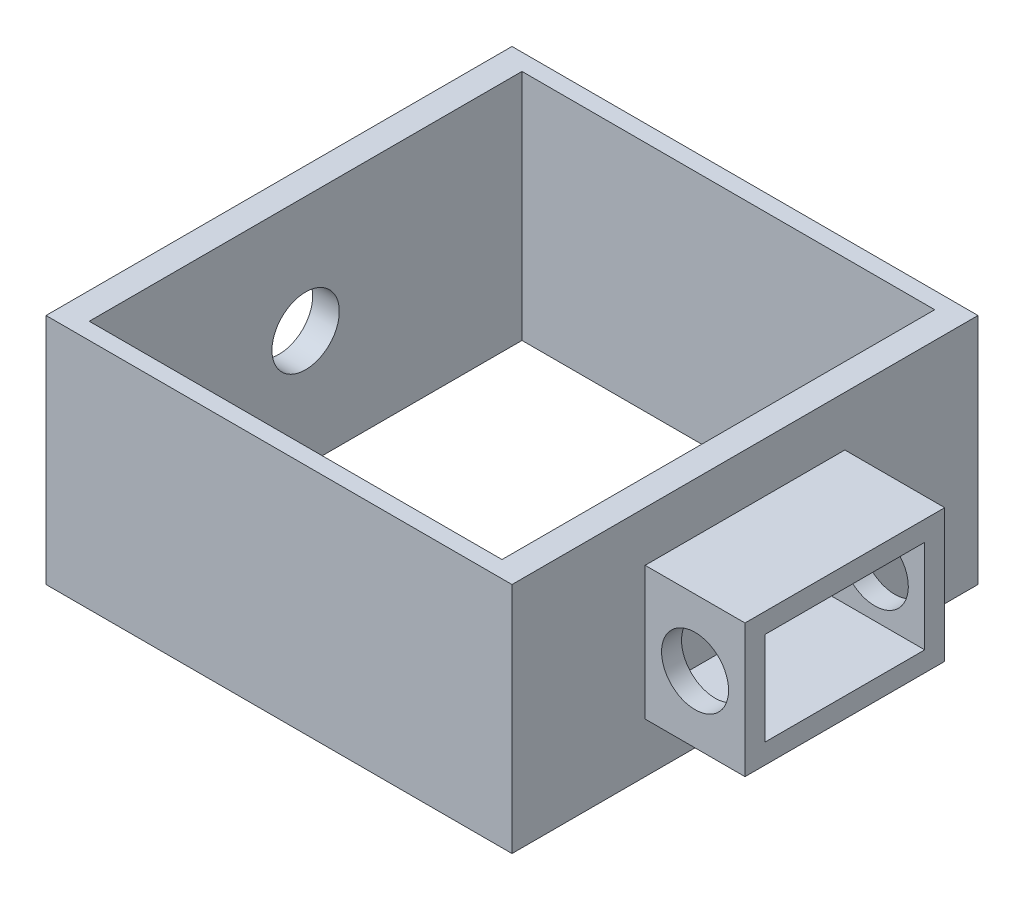
ISO-10303-21;
HEADER;
FILE_DESCRIPTION(('STEP AP214'),'2;1');
FILE_NAME('part.step','',(''),(''),'','','');
FILE_SCHEMA(('AUTOMOTIVE_DESIGN { 1 0 10303 214 1 1 1 1 }'));
ENDSEC;
DATA;
#1=APPLICATION_CONTEXT('core data for automotive mechanical design processes');
#2=APPLICATION_PROTOCOL_DEFINITION('international standard','automotive_design',2000,#1);
#3=PRODUCT_CONTEXT('',#1,'mechanical');
#4=PRODUCT('Part','Part','',(#3));
#5=PRODUCT_RELATED_PRODUCT_CATEGORY('part','',(#4));
#6=PRODUCT_DEFINITION_FORMATION('','',#4);
#7=PRODUCT_DEFINITION_CONTEXT('part definition',#1,'design');
#8=PRODUCT_DEFINITION('design','',#6,#7);
#9=PRODUCT_DEFINITION_SHAPE('','',#8);
#10=(LENGTH_UNIT() NAMED_UNIT(*) SI_UNIT(.MILLI.,.METRE.));
#11=(NAMED_UNIT(*) PLANE_ANGLE_UNIT() SI_UNIT($,.RADIAN.));
#12=(NAMED_UNIT(*) SI_UNIT($,.STERADIAN.) SOLID_ANGLE_UNIT());
#13=UNCERTAINTY_MEASURE_WITH_UNIT(LENGTH_MEASURE(1.E-05),#10,'distance_accuracy_value','');
#14=(GEOMETRIC_REPRESENTATION_CONTEXT(3) GLOBAL_UNCERTAINTY_ASSIGNED_CONTEXT((#13)) GLOBAL_UNIT_ASSIGNED_CONTEXT((#10,
#11,#12)) REPRESENTATION_CONTEXT('',''));
#15=CARTESIAN_POINT('',(0.,0.,0.));
#16=DIRECTION('',(0.,0.,1.));
#17=DIRECTION('',(1.,0.,0.));
#18=AXIS2_PLACEMENT_3D('',#15,#16,#17);
#19=CARTESIAN_POINT('',(35.,35.,-35.));
#20=DIRECTION('',(-1.,0.,0.));
#21=DIRECTION('',(0.,0.,1.));
#22=AXIS2_PLACEMENT_3D('',#19,#20,#21);
#23=PLANE('',#22);
#24=DIRECTION('',(0.,0.,-1.));
#25=VECTOR('',#24,1.);
#26=CARTESIAN_POINT('',(35.,0.,-35.));
#27=LINE('',#26,#25);
#28=CARTESIAN_POINT('',(35.,0.,35.));
#29=VERTEX_POINT('',#28);
#30=CARTESIAN_POINT('',(35.,0.,-35.));
#31=VERTEX_POINT('',#30);
#32=EDGE_CURVE('E289',#29,#31,#27,.T.);
#33=ORIENTED_EDGE('',*,*,#32,.T.);
#34=DIRECTION('',(0.,-1.,0.));
#35=VECTOR('',#34,1.);
#36=CARTESIAN_POINT('',(35.,35.,-35.));
#37=LINE('',#36,#35);
#38=CARTESIAN_POINT('',(35.,35.,-35.));
#39=VERTEX_POINT('',#38);
#40=EDGE_CURVE('E11',#39,#31,#37,.T.);
#41=ORIENTED_EDGE('',*,*,#40,.F.);
#42=DIRECTION('',(0.,0.,-1.));
#43=VECTOR('',#42,1.);
#44=CARTESIAN_POINT('',(35.,35.,-35.));
#45=LINE('',#44,#43);
#46=CARTESIAN_POINT('',(35.,35.,35.));
#47=VERTEX_POINT('',#46);
#48=EDGE_CURVE('E299',#47,#39,#45,.T.);
#49=ORIENTED_EDGE('',*,*,#48,.F.);
#50=DIRECTION('',(0.,-1.,0.));
#51=VECTOR('',#50,1.);
#52=CARTESIAN_POINT('',(35.,35.,35.));
#53=LINE('',#52,#51);
#54=EDGE_CURVE('E313',#47,#29,#53,.T.);
#55=ORIENTED_EDGE('',*,*,#54,.T.);
#56=EDGE_LOOP('',(#33,#41,#49,#55));
#57=FACE_BOUND('',#56,.T.);
#58=DIRECTION('',(0.,1.,0.));
#59=VECTOR('',#58,1.);
#60=CARTESIAN_POINT('',(35.,27.5,-15.));
#61=LINE('',#60,#59);
#62=CARTESIAN_POINT('',(35.,7.5,-15.));
#63=VERTEX_POINT('',#62);
#64=CARTESIAN_POINT('',(35.,27.5,-15.));
#65=VERTEX_POINT('',#64);
#66=EDGE_CURVE('E64',#63,#65,#61,.T.);
#67=ORIENTED_EDGE('',*,*,#66,.F.);
#68=DIRECTION('',(0.,0.,-1.));
#69=VECTOR('',#68,1.);
#70=CARTESIAN_POINT('',(35.,7.5,15.));
#71=LINE('',#70,#69);
#72=CARTESIAN_POINT('',(35.,7.5,15.));
#73=VERTEX_POINT('',#72);
#74=EDGE_CURVE('E212',#73,#63,#71,.T.);
#75=ORIENTED_EDGE('',*,*,#74,.F.);
#76=DIRECTION('',(0.,-1.,0.));
#77=VECTOR('',#76,1.);
#78=CARTESIAN_POINT('',(35.,27.5,15.));
#79=LINE('',#78,#77);
#80=CARTESIAN_POINT('',(35.,27.5,15.));
#81=VERTEX_POINT('',#80);
#82=EDGE_CURVE('E228',#81,#73,#79,.T.);
#83=ORIENTED_EDGE('',*,*,#82,.F.);
#84=DIRECTION('',(0.,0.,1.));
#85=VECTOR('',#84,1.);
#86=CARTESIAN_POINT('',(35.,27.5,15.));
#87=LINE('',#86,#85);
#88=EDGE_CURVE('E224',#65,#81,#87,.T.);
#89=ORIENTED_EDGE('',*,*,#88,.F.);
#90=EDGE_LOOP('',(#67,#75,#83,#89));
#91=FACE_BOUND('',#90,.T.);
#92=ADVANCED_FACE('F39',(#57,#91),#23,.F.);
#93=CARTESIAN_POINT('',(-35.,35.,-35.));
#94=DIRECTION('',(0.,0.,1.));
#95=DIRECTION('',(1.,0.,0.));
#96=AXIS2_PLACEMENT_3D('',#93,#94,#95);
#97=PLANE('',#96);
#98=DIRECTION('',(-1.,0.,0.));
#99=VECTOR('',#98,1.);
#100=CARTESIAN_POINT('',(-35.,0.,-35.));
#101=LINE('',#100,#99);
#102=CARTESIAN_POINT('',(-35.,0.,-35.));
#103=VERTEX_POINT('',#102);
#104=EDGE_CURVE('E317',#31,#103,#101,.T.);
#105=ORIENTED_EDGE('',*,*,#104,.T.);
#106=DIRECTION('',(0.,-1.,0.));
#107=VECTOR('',#106,1.);
#108=CARTESIAN_POINT('',(-35.,35.,-35.));
#109=LINE('',#108,#107);
#110=CARTESIAN_POINT('',(-35.,35.,-35.));
#111=VERTEX_POINT('',#110);
#112=EDGE_CURVE('E48',#111,#103,#109,.T.);
#113=ORIENTED_EDGE('',*,*,#112,.F.);
#114=DIRECTION('',(-1.,0.,0.));
#115=VECTOR('',#114,1.);
#116=CARTESIAN_POINT('',(-35.,35.,-35.));
#117=LINE('',#116,#115);
#118=EDGE_CURVE('E303',#39,#111,#117,.T.);
#119=ORIENTED_EDGE('',*,*,#118,.F.);
#120=ORIENTED_EDGE('',*,*,#40,.T.);
#121=EDGE_LOOP('',(#105,#113,#119,#120));
#122=FACE_BOUND('',#121,.T.);
#123=ADVANCED_FACE('F359',(#122),#97,.F.);
#124=CARTESIAN_POINT('',(-35.,35.,-35.));
#125=DIRECTION('',(1.,0.,0.));
#126=DIRECTION('',(0.,0.,-1.));
#127=AXIS2_PLACEMENT_3D('',#124,#125,#126);
#128=PLANE('',#127);
#129=CARTESIAN_POINT('',(-35.,17.5,0.));
#130=DIRECTION('',(-1.,0.,0.));
#131=DIRECTION('',(0.,0.,1.));
#132=AXIS2_PLACEMENT_3D('',#129,#130,#131);
#133=CIRCLE('',#132,5.05676891485003);
#134=CARTESIAN_POINT('',(-35.,17.5,5.05676891485003));
#135=VERTEX_POINT('',#134);
#136=EDGE_CURVE('E249',#135,#135,#133,.T.);
#137=ORIENTED_EDGE('',*,*,#136,.F.);
#138=EDGE_LOOP('',(#137));
#139=FACE_BOUND('',#138,.T.);
#140=DIRECTION('',(0.,0.,1.));
#141=VECTOR('',#140,1.);
#142=CARTESIAN_POINT('',(-35.,0.,-35.));
#143=LINE('',#142,#141);
#144=CARTESIAN_POINT('',(-35.,0.,35.));
#145=VERTEX_POINT('',#144);
#146=EDGE_CURVE('E320',#103,#145,#143,.T.);
#147=ORIENTED_EDGE('',*,*,#146,.T.);
#148=DIRECTION('',(0.,-1.,0.));
#149=VECTOR('',#148,1.);
#150=CARTESIAN_POINT('',(-35.,35.,35.));
#151=LINE('',#150,#149);
#152=CARTESIAN_POINT('',(-35.,35.,35.));
#153=VERTEX_POINT('',#152);
#154=EDGE_CURVE('E328',#153,#145,#151,.T.);
#155=ORIENTED_EDGE('',*,*,#154,.F.);
#156=DIRECTION('',(0.,0.,1.));
#157=VECTOR('',#156,1.);
#158=CARTESIAN_POINT('',(-35.,35.,-35.));
#159=LINE('',#158,#157);
#160=EDGE_CURVE('E307',#111,#153,#159,.T.);
#161=ORIENTED_EDGE('',*,*,#160,.F.);
#162=ORIENTED_EDGE('',*,*,#112,.T.);
#163=EDGE_LOOP('',(#147,#155,#161,#162));
#164=FACE_BOUND('',#163,.T.);
#165=ADVANCED_FACE('F365',(#139,#164),#128,.F.);
#166=CARTESIAN_POINT('',(-35.,35.,35.));
#167=DIRECTION('',(0.,0.,-1.));
#168=DIRECTION('',(-1.,0.,0.));
#169=AXIS2_PLACEMENT_3D('',#166,#167,#168);
#170=PLANE('',#169);
#171=DIRECTION('',(1.,0.,0.));
#172=VECTOR('',#171,1.);
#173=CARTESIAN_POINT('',(-35.,0.,35.));
#174=LINE('',#173,#172);
#175=EDGE_CURVE('E304',#145,#29,#174,.T.);
#176=ORIENTED_EDGE('',*,*,#175,.T.);
#177=ORIENTED_EDGE('',*,*,#54,.F.);
#178=DIRECTION('',(1.,0.,0.));
#179=VECTOR('',#178,1.);
#180=CARTESIAN_POINT('',(-35.,35.,35.));
#181=LINE('',#180,#179);
#182=EDGE_CURVE('E310',#153,#47,#181,.T.);
#183=ORIENTED_EDGE('',*,*,#182,.F.);
#184=ORIENTED_EDGE('',*,*,#154,.T.);
#185=EDGE_LOOP('',(#176,#177,#183,#184));
#186=FACE_BOUND('',#185,.T.);
#187=ADVANCED_FACE('F382',(#186),#170,.F.);
#188=CARTESIAN_POINT('',(0.,35.,0.));
#189=DIRECTION('',(0.,1.,0.));
#190=DIRECTION('',(0.,0.,1.));
#191=AXIS2_PLACEMENT_3D('',#188,#189,#190);
#192=PLANE('',#191);
#193=DIRECTION('',(0.,0.,-1.));
#194=VECTOR('',#193,1.);
#195=CARTESIAN_POINT('',(31.,35.,-32.5));
#196=LINE('',#195,#194);
#197=CARTESIAN_POINT('',(31.,35.,32.5));
#198=VERTEX_POINT('',#197);
#199=CARTESIAN_POINT('',(31.,35.,-32.5));
#200=VERTEX_POINT('',#199);
#201=EDGE_CURVE('E272',#198,#200,#196,.T.);
#202=ORIENTED_EDGE('',*,*,#201,.F.);
#203=DIRECTION('',(1.,0.,0.));
#204=VECTOR('',#203,1.);
#205=CARTESIAN_POINT('',(-31.,35.,32.5));
#206=LINE('',#205,#204);
#207=CARTESIAN_POINT('',(-31.,35.,32.5));
#208=VERTEX_POINT('',#207);
#209=EDGE_CURVE('E259',#208,#198,#206,.T.);
#210=ORIENTED_EDGE('',*,*,#209,.F.);
#211=DIRECTION('',(0.,0.,1.));
#212=VECTOR('',#211,1.);
#213=CARTESIAN_POINT('',(-31.,35.,-32.5));
#214=LINE('',#213,#212);
#215=CARTESIAN_POINT('',(-31.,35.,-32.5));
#216=VERTEX_POINT('',#215);
#217=EDGE_CURVE('E279',#216,#208,#214,.T.);
#218=ORIENTED_EDGE('',*,*,#217,.F.);
#219=DIRECTION('',(-1.,0.,0.));
#220=VECTOR('',#219,1.);
#221=CARTESIAN_POINT('',(-31.,35.,-32.5));
#222=LINE('',#221,#220);
#223=EDGE_CURVE('E275',#200,#216,#222,.T.);
#224=ORIENTED_EDGE('',*,*,#223,.F.);
#225=EDGE_LOOP('',(#202,#210,#218,#224));
#226=FACE_BOUND('',#225,.T.);
#227=ORIENTED_EDGE('',*,*,#48,.T.);
#228=ORIENTED_EDGE('',*,*,#118,.T.);
#229=ORIENTED_EDGE('',*,*,#160,.T.);
#230=ORIENTED_EDGE('',*,*,#182,.T.);
#231=EDGE_LOOP('',(#227,#228,#229,#230));
#232=FACE_BOUND('',#231,.T.);
#233=ADVANCED_FACE('F378',(#226,#232),#192,.T.);
#234=CARTESIAN_POINT('',(0.,0.,0.));
#235=DIRECTION('',(0.,1.,0.));
#236=DIRECTION('',(0.,0.,1.));
#237=AXIS2_PLACEMENT_3D('',#234,#235,#236);
#238=PLANE('',#237);
#239=DIRECTION('',(1.,0.,0.));
#240=VECTOR('',#239,1.);
#241=CARTESIAN_POINT('',(-31.,0.,32.5));
#242=LINE('',#241,#240);
#243=CARTESIAN_POINT('',(-31.,0.,32.5));
#244=VERTEX_POINT('',#243);
#245=CARTESIAN_POINT('',(31.,0.,32.5));
#246=VERTEX_POINT('',#245);
#247=EDGE_CURVE('E267',#244,#246,#242,.T.);
#248=ORIENTED_EDGE('',*,*,#247,.T.);
#249=DIRECTION('',(0.,0.,-1.));
#250=VECTOR('',#249,1.);
#251=CARTESIAN_POINT('',(31.,0.,-32.5));
#252=LINE('',#251,#250);
#253=CARTESIAN_POINT('',(31.,0.,-32.5));
#254=VERTEX_POINT('',#253);
#255=EDGE_CURVE('E254',#246,#254,#252,.T.);
#256=ORIENTED_EDGE('',*,*,#255,.T.);
#257=DIRECTION('',(-1.,0.,0.));
#258=VECTOR('',#257,1.);
#259=CARTESIAN_POINT('',(-31.,0.,-32.5));
#260=LINE('',#259,#258);
#261=CARTESIAN_POINT('',(-31.,0.,-32.5));
#262=VERTEX_POINT('',#261);
#263=EDGE_CURVE('E258',#254,#262,#260,.T.);
#264=ORIENTED_EDGE('',*,*,#263,.T.);
#265=DIRECTION('',(0.,0.,1.));
#266=VECTOR('',#265,1.);
#267=CARTESIAN_POINT('',(-31.,0.,-32.5));
#268=LINE('',#267,#266);
#269=EDGE_CURVE('E263',#262,#244,#268,.T.);
#270=ORIENTED_EDGE('',*,*,#269,.T.);
#271=EDGE_LOOP('',(#248,#256,#264,#270));
#272=FACE_BOUND('',#271,.T.);
#273=ORIENTED_EDGE('',*,*,#32,.F.);
#274=ORIENTED_EDGE('',*,*,#175,.F.);
#275=ORIENTED_EDGE('',*,*,#146,.F.);
#276=ORIENTED_EDGE('',*,*,#104,.F.);
#277=EDGE_LOOP('',(#273,#274,#275,#276));
#278=FACE_BOUND('',#277,.T.);
#279=ADVANCED_FACE('F373',(#272,#278),#238,.F.);
#280=CARTESIAN_POINT('',(31.,0.,-32.5));
#281=DIRECTION('',(1.,0.,0.));
#282=DIRECTION('',(0.,0.,-1.));
#283=AXIS2_PLACEMENT_3D('',#280,#281,#282);
#284=PLANE('',#283);
#285=ORIENTED_EDGE('',*,*,#201,.T.);
#286=DIRECTION('',(0.,1.,0.));
#287=VECTOR('',#286,1.);
#288=CARTESIAN_POINT('',(31.,0.,-32.5));
#289=LINE('',#288,#287);
#290=EDGE_CURVE('E271',#254,#200,#289,.T.);
#291=ORIENTED_EDGE('',*,*,#290,.F.);
#292=ORIENTED_EDGE('',*,*,#255,.F.);
#293=DIRECTION('',(0.,1.,0.));
#294=VECTOR('',#293,1.);
#295=CARTESIAN_POINT('',(31.,0.,32.5));
#296=LINE('',#295,#294);
#297=EDGE_CURVE('E286',#246,#198,#296,.T.);
#298=ORIENTED_EDGE('',*,*,#297,.T.);
#299=EDGE_LOOP('',(#285,#291,#292,#298));
#300=FACE_BOUND('',#299,.T.);
#301=ADVANCED_FACE('F395',(#300),#284,.F.);
#302=CARTESIAN_POINT('',(-31.,0.,32.5));
#303=DIRECTION('',(0.,0.,1.));
#304=DIRECTION('',(1.,0.,0.));
#305=AXIS2_PLACEMENT_3D('',#302,#303,#304);
#306=PLANE('',#305);
#307=ORIENTED_EDGE('',*,*,#209,.T.);
#308=ORIENTED_EDGE('',*,*,#297,.F.);
#309=ORIENTED_EDGE('',*,*,#247,.F.);
#310=DIRECTION('',(0.,1.,0.));
#311=VECTOR('',#310,1.);
#312=CARTESIAN_POINT('',(-31.,0.,32.5));
#313=LINE('',#312,#311);
#314=EDGE_CURVE('E290',#244,#208,#313,.T.);
#315=ORIENTED_EDGE('',*,*,#314,.T.);
#316=EDGE_LOOP('',(#307,#308,#309,#315));
#317=FACE_BOUND('',#316,.T.);
#318=ADVANCED_FACE('F401',(#317),#306,.F.);
#319=CARTESIAN_POINT('',(-31.,0.,-32.5));
#320=DIRECTION('',(-1.,0.,0.));
#321=DIRECTION('',(0.,0.,1.));
#322=AXIS2_PLACEMENT_3D('',#319,#320,#321);
#323=PLANE('',#322);
#324=CARTESIAN_POINT('',(-31.,17.5,0.));
#325=DIRECTION('',(-1.,0.,0.));
#326=DIRECTION('',(0.,0.,1.));
#327=AXIS2_PLACEMENT_3D('',#324,#325,#326);
#328=CIRCLE('',#327,5.05676891485003);
#329=CARTESIAN_POINT('',(-31.,17.5,5.05676891485003));
#330=VERTEX_POINT('',#329);
#331=EDGE_CURVE('E253',#330,#330,#328,.T.);
#332=ORIENTED_EDGE('',*,*,#331,.T.);
#333=EDGE_LOOP('',(#332));
#334=FACE_BOUND('',#333,.T.);
#335=ORIENTED_EDGE('',*,*,#217,.T.);
#336=ORIENTED_EDGE('',*,*,#314,.F.);
#337=ORIENTED_EDGE('',*,*,#269,.F.);
#338=DIRECTION('',(0.,1.,0.));
#339=VECTOR('',#338,1.);
#340=CARTESIAN_POINT('',(-31.,0.,-32.5));
#341=LINE('',#340,#339);
#342=EDGE_CURVE('E293',#262,#216,#341,.T.);
#343=ORIENTED_EDGE('',*,*,#342,.T.);
#344=EDGE_LOOP('',(#335,#336,#337,#343));
#345=FACE_BOUND('',#344,.T.);
#346=ADVANCED_FACE('F338',(#334,#345),#323,.F.);
#347=CARTESIAN_POINT('',(-31.,0.,-32.5));
#348=DIRECTION('',(0.,0.,-1.));
#349=DIRECTION('',(-1.,0.,0.));
#350=AXIS2_PLACEMENT_3D('',#347,#348,#349);
#351=PLANE('',#350);
#352=ORIENTED_EDGE('',*,*,#223,.T.);
#353=ORIENTED_EDGE('',*,*,#342,.F.);
#354=ORIENTED_EDGE('',*,*,#263,.F.);
#355=ORIENTED_EDGE('',*,*,#290,.T.);
#356=EDGE_LOOP('',(#352,#353,#354,#355));
#357=FACE_BOUND('',#356,.T.);
#358=ADVANCED_FACE('F344',(#357),#351,.F.);
#359=CARTESIAN_POINT('',(-20.,17.5,0.));
#360=DIRECTION('',(-1.,0.,0.));
#361=DIRECTION('',(0.,0.,1.));
#362=AXIS2_PLACEMENT_3D('',#359,#360,#361);
#363=CYLINDRICAL_SURFACE('',#362,5.05676891485003);
#364=CARTESIAN_POINT('',(-35.,17.5,5.05676891485003));
#365=CARTESIAN_POINT('',(-34.9583333333333,17.5,5.05676891485003));
#366=CARTESIAN_POINT('',(-34.9166666666667,17.5,5.05676891485003));
#367=CARTESIAN_POINT('',(-34.8333333333333,17.5,5.05676891485003));
#368=CARTESIAN_POINT('',(-34.7916666666667,17.5,5.05676891485003));
#369=CARTESIAN_POINT('',(-34.7083333333333,17.5,5.05676891485003));
#370=CARTESIAN_POINT('',(-34.6666666666667,17.5,5.05676891485003));
#371=CARTESIAN_POINT('',(-34.5833333333333,17.5,5.05676891485003));
#372=CARTESIAN_POINT('',(-34.5416666666667,17.5,5.05676891485003));
#373=CARTESIAN_POINT('',(-34.4583333333333,17.5,5.05676891485003));
#374=CARTESIAN_POINT('',(-34.4166666666667,17.5,5.05676891485003));
#375=CARTESIAN_POINT('',(-34.3333333333333,17.5,5.05676891485003));
#376=CARTESIAN_POINT('',(-34.2916666666667,17.5,5.05676891485003));
#377=CARTESIAN_POINT('',(-34.2083333333333,17.5,5.05676891485003));
#378=CARTESIAN_POINT('',(-34.1666666666667,17.5,5.05676891485003));
#379=CARTESIAN_POINT('',(-34.0833333333333,17.5,5.05676891485003));
#380=CARTESIAN_POINT('',(-34.0416666666667,17.5,5.05676891485003));
#381=CARTESIAN_POINT('',(-33.9583333333333,17.5,5.05676891485003));
#382=CARTESIAN_POINT('',(-33.9166666666667,17.5,5.05676891485003));
#383=CARTESIAN_POINT('',(-33.8333333333333,17.5,5.05676891485003));
#384=CARTESIAN_POINT('',(-33.7916666666667,17.5,5.05676891485003));
#385=CARTESIAN_POINT('',(-33.7083333333333,17.5,5.05676891485003));
#386=CARTESIAN_POINT('',(-33.6666666666667,17.5,5.05676891485003));
#387=CARTESIAN_POINT('',(-33.5833333333333,17.5,5.05676891485003));
#388=CARTESIAN_POINT('',(-33.5416666666667,17.5,5.05676891485003));
#389=CARTESIAN_POINT('',(-33.4583333333333,17.5,5.05676891485003));
#390=CARTESIAN_POINT('',(-33.4166666666667,17.5,5.05676891485003));
#391=CARTESIAN_POINT('',(-33.3333333333333,17.5,5.05676891485003));
#392=CARTESIAN_POINT('',(-33.2916666666667,17.5,5.05676891485003));
#393=CARTESIAN_POINT('',(-33.2083333333333,17.5,5.05676891485003));
#394=CARTESIAN_POINT('',(-33.1666666666667,17.5,5.05676891485003));
#395=CARTESIAN_POINT('',(-33.0833333333333,17.5,5.05676891485003));
#396=CARTESIAN_POINT('',(-33.0416666666667,17.5,5.05676891485003));
#397=CARTESIAN_POINT('',(-32.9583333333333,17.5,5.05676891485003));
#398=CARTESIAN_POINT('',(-32.9166666666667,17.5,5.05676891485003));
#399=CARTESIAN_POINT('',(-32.8333333333333,17.5,5.05676891485003));
#400=CARTESIAN_POINT('',(-32.7916666666667,17.5,5.05676891485003));
#401=CARTESIAN_POINT('',(-32.7083333333333,17.5,5.05676891485003));
#402=CARTESIAN_POINT('',(-32.6666666666667,17.5,5.05676891485003));
#403=CARTESIAN_POINT('',(-32.5833333333333,17.5,5.05676891485003));
#404=CARTESIAN_POINT('',(-32.5416666666667,17.5,5.05676891485003));
#405=CARTESIAN_POINT('',(-32.4583333333333,17.5,5.05676891485003));
#406=CARTESIAN_POINT('',(-32.4166666666667,17.5,5.05676891485003));
#407=CARTESIAN_POINT('',(-32.3333333333333,17.5,5.05676891485003));
#408=CARTESIAN_POINT('',(-32.2916666666667,17.5,5.05676891485003));
#409=CARTESIAN_POINT('',(-32.2083333333333,17.5,5.05676891485003));
#410=CARTESIAN_POINT('',(-32.1666666666667,17.5,5.05676891485003));
#411=CARTESIAN_POINT('',(-32.0833333333333,17.5,5.05676891485003));
#412=CARTESIAN_POINT('',(-32.0416666666667,17.5,5.05676891485003));
#413=CARTESIAN_POINT('',(-31.9583333333333,17.5,5.05676891485003));
#414=CARTESIAN_POINT('',(-31.9166666666667,17.5,5.05676891485003));
#415=CARTESIAN_POINT('',(-31.8333333333333,17.5,5.05676891485003));
#416=CARTESIAN_POINT('',(-31.7916666666667,17.5,5.05676891485003));
#417=CARTESIAN_POINT('',(-31.7083333333333,17.5,5.05676891485003));
#418=CARTESIAN_POINT('',(-31.6666666666667,17.5,5.05676891485003));
#419=CARTESIAN_POINT('',(-31.5833333333333,17.5,5.05676891485003));
#420=CARTESIAN_POINT('',(-31.5416666666667,17.5,5.05676891485003));
#421=CARTESIAN_POINT('',(-31.4583333333333,17.5,5.05676891485003));
#422=CARTESIAN_POINT('',(-31.4166666666667,17.5,5.05676891485003));
#423=CARTESIAN_POINT('',(-31.3333333333333,17.5,5.05676891485003));
#424=CARTESIAN_POINT('',(-31.2916666666667,17.5,5.05676891485003));
#425=CARTESIAN_POINT('',(-31.2083333333333,17.5,5.05676891485003));
#426=CARTESIAN_POINT('',(-31.1666666666667,17.5,5.05676891485003));
#427=CARTESIAN_POINT('',(-31.0833333333333,17.5,5.05676891485003));
#428=CARTESIAN_POINT('',(-31.0416666666667,17.5,5.05676891485003));
#429=CARTESIAN_POINT('',(-31.,17.5,5.05676891485003));
#430=B_SPLINE_CURVE_WITH_KNOTS('',3,(#364,#365,#366,#367,#368,#369,#370,#371,#372,#373,#374,
#375,#376,#377,#378,#379,#380,#381,#382,#383,#384,#385,#386,#387,#388,#389,#390,#391,#392,#393,
#394,#395,#396,#397,#398,#399,#400,#401,#402,#403,#404,#405,#406,#407,#408,#409,#410,#411,#412,
#413,#414,#415,#416,#417,#418,#419,#420,#421,#422,#423,#424,#425,#426,#427,#428,#429),
.UNSPECIFIED.,.F.,.F.,(4,2,2,2,2,2,2,2,2,2,2,2,2,2,2,2,2,2,2,2,2,2,2,2,2,2,2,2,2,2,2,2,4),(0.,
0.125,0.25,0.375,0.5,0.625000000000001,0.750000000000001,0.875000000000001,1.,1.125,1.25,1.375,
1.5,1.625,1.75,1.875,2.,2.125,2.25,2.375,2.5,2.625,2.75,2.875,3.,3.125,3.25,3.375,3.5,3.625,
3.75,3.875,4.),.UNSPECIFIED.);
#431=EDGE_CURVE('BSEAM341',#135,#330,#430,.T.);
#432=ORIENTED_EDGE('',*,*,#136,.T.);
#433=ORIENTED_EDGE('',*,*,#331,.F.);
#434=ORIENTED_EDGE('',*,*,#431,.T.);
#435=ORIENTED_EDGE('',*,*,#431,.F.);
#436=EDGE_LOOP('',(#432,#434,#433,#435));
#437=FACE_BOUND('',#436,.T.);
#438=ADVANCED_FACE('F341',(#437),#363,.F.);
#439=CARTESIAN_POINT('',(50.,27.5,-15.));
#440=DIRECTION('',(0.,0.,1.));
#441=DIRECTION('',(0.,-1.,0.));
#442=AXIS2_PLACEMENT_3D('',#439,#440,#441);
#443=PLANE('',#442);
#444=CARTESIAN_POINT('',(42.5,17.5,-15.));
#445=DIRECTION('',(0.,0.,1.));
#446=DIRECTION('',(0.,-1.,0.));
#447=AXIS2_PLACEMENT_3D('',#444,#445,#446);
#448=CIRCLE('',#447,5.03388011456602);
#449=CARTESIAN_POINT('',(42.5,12.466119885434,-15.));
#450=VERTEX_POINT('',#449);
#451=EDGE_CURVE('E184',#450,#450,#448,.T.);
#452=ORIENTED_EDGE('',*,*,#451,.T.);
#453=EDGE_LOOP('',(#452));
#454=FACE_BOUND('',#453,.T.);
#455=ORIENTED_EDGE('',*,*,#66,.T.);
#456=DIRECTION('',(-1.,0.,0.));
#457=VECTOR('',#456,1.);
#458=CARTESIAN_POINT('',(50.,27.5,-15.));
#459=LINE('',#458,#457);
#460=CARTESIAN_POINT('',(50.,27.5,-15.));
#461=VERTEX_POINT('',#460);
#462=EDGE_CURVE('E245',#461,#65,#459,.T.);
#463=ORIENTED_EDGE('',*,*,#462,.F.);
#464=DIRECTION('',(0.,1.,0.));
#465=VECTOR('',#464,1.);
#466=CARTESIAN_POINT('',(50.,27.5,-15.));
#467=LINE('',#466,#465);
#468=CARTESIAN_POINT('',(50.,7.5,-15.));
#469=VERTEX_POINT('',#468);
#470=EDGE_CURVE('E207',#469,#461,#467,.T.);
#471=ORIENTED_EDGE('',*,*,#470,.F.);
#472=DIRECTION('',(-1.,0.,0.));
#473=VECTOR('',#472,1.);
#474=CARTESIAN_POINT('',(50.,7.5,-15.));
#475=LINE('',#474,#473);
#476=EDGE_CURVE('E221',#469,#63,#475,.T.);
#477=ORIENTED_EDGE('',*,*,#476,.T.);
#478=EDGE_LOOP('',(#455,#463,#471,#477));
#479=FACE_BOUND('',#478,.T.);
#480=ADVANCED_FACE('F343',(#454,#479),#443,.F.);
#481=CARTESIAN_POINT('',(50.,27.5,15.));
#482=DIRECTION('',(0.,-1.,0.));
#483=DIRECTION('',(0.,0.,-1.));
#484=AXIS2_PLACEMENT_3D('',#481,#482,#483);
#485=PLANE('',#484);
#486=ORIENTED_EDGE('',*,*,#88,.T.);
#487=DIRECTION('',(-1.,0.,0.));
#488=VECTOR('',#487,1.);
#489=CARTESIAN_POINT('',(50.,27.5,15.));
#490=LINE('',#489,#488);
#491=CARTESIAN_POINT('',(50.,27.5,15.));
#492=VERTEX_POINT('',#491);
#493=EDGE_CURVE('E241',#492,#81,#490,.T.);
#494=ORIENTED_EDGE('',*,*,#493,.F.);
#495=DIRECTION('',(0.,0.,1.));
#496=VECTOR('',#495,1.);
#497=CARTESIAN_POINT('',(50.,27.5,15.));
#498=LINE('',#497,#496);
#499=EDGE_CURVE('E211',#461,#492,#498,.T.);
#500=ORIENTED_EDGE('',*,*,#499,.F.);
#501=ORIENTED_EDGE('',*,*,#462,.T.);
#502=EDGE_LOOP('',(#486,#494,#500,#501));
#503=FACE_BOUND('',#502,.T.);
#504=ADVANCED_FACE('F352',(#503),#485,.F.);
#505=CARTESIAN_POINT('',(50.,27.5,15.));
#506=DIRECTION('',(0.,0.,-1.));
#507=DIRECTION('',(0.,1.,0.));
#508=AXIS2_PLACEMENT_3D('',#505,#506,#507);
#509=PLANE('',#508);
#510=CARTESIAN_POINT('',(42.5,17.5,15.));
#511=DIRECTION('',(0.,0.,1.));
#512=DIRECTION('',(1.,0.,0.));
#513=AXIS2_PLACEMENT_3D('',#510,#511,#512);
#514=CIRCLE('',#513,5.03388011456602);
#515=CARTESIAN_POINT('',(47.533880114566,17.5,15.));
#516=VERTEX_POINT('',#515);
#517=EDGE_CURVE('E592',#516,#516,#514,.T.);
#518=ORIENTED_EDGE('',*,*,#517,.F.);
#519=EDGE_LOOP('',(#518));
#520=FACE_BOUND('',#519,.T.);
#521=ORIENTED_EDGE('',*,*,#82,.T.);
#522=DIRECTION('',(-1.,0.,0.));
#523=VECTOR('',#522,1.);
#524=CARTESIAN_POINT('',(50.,7.5,15.));
#525=LINE('',#524,#523);
#526=CARTESIAN_POINT('',(50.,7.5,15.));
#527=VERTEX_POINT('',#526);
#528=EDGE_CURVE('E237',#527,#73,#525,.T.);
#529=ORIENTED_EDGE('',*,*,#528,.F.);
#530=DIRECTION('',(0.,-1.,0.));
#531=VECTOR('',#530,1.);
#532=CARTESIAN_POINT('',(50.,27.5,15.));
#533=LINE('',#532,#531);
#534=EDGE_CURVE('E215',#492,#527,#533,.T.);
#535=ORIENTED_EDGE('',*,*,#534,.F.);
#536=ORIENTED_EDGE('',*,*,#493,.T.);
#537=EDGE_LOOP('',(#521,#529,#535,#536));
#538=FACE_BOUND('',#537,.T.);
#539=ADVANCED_FACE('F486',(#520,#538),#509,.F.);
#540=CARTESIAN_POINT('',(50.,7.5,15.));
#541=DIRECTION('',(0.,1.,0.));
#542=DIRECTION('',(0.,0.,1.));
#543=AXIS2_PLACEMENT_3D('',#540,#541,#542);
#544=PLANE('',#543);
#545=ORIENTED_EDGE('',*,*,#74,.T.);
#546=ORIENTED_EDGE('',*,*,#476,.F.);
#547=DIRECTION('',(0.,0.,-1.));
#548=VECTOR('',#547,1.);
#549=CARTESIAN_POINT('',(50.,7.5,15.));
#550=LINE('',#549,#548);
#551=EDGE_CURVE('E218',#527,#469,#550,.T.);
#552=ORIENTED_EDGE('',*,*,#551,.F.);
#553=ORIENTED_EDGE('',*,*,#528,.T.);
#554=EDGE_LOOP('',(#545,#546,#552,#553));
#555=FACE_BOUND('',#554,.T.);
#556=ADVANCED_FACE('F495',(#555),#544,.F.);
#557=CARTESIAN_POINT('',(50.,0.,0.));
#558=DIRECTION('',(1.,0.,0.));
#559=DIRECTION('',(0.,0.,-1.));
#560=AXIS2_PLACEMENT_3D('',#557,#558,#559);
#561=PLANE('',#560);
#562=DIRECTION('',(0.,1.,0.));
#563=VECTOR('',#562,1.);
#564=CARTESIAN_POINT('',(50.,24.5,-12.));
#565=LINE('',#564,#563);
#566=CARTESIAN_POINT('',(50.,10.5,-12.));
#567=VERTEX_POINT('',#566);
#568=CARTESIAN_POINT('',(50.,24.5,-12.));
#569=VERTEX_POINT('',#568);
#570=EDGE_CURVE('E56',#567,#569,#565,.T.);
#571=ORIENTED_EDGE('',*,*,#570,.F.);
#572=DIRECTION('',(0.,0.,-1.));
#573=VECTOR('',#572,1.);
#574=CARTESIAN_POINT('',(50.,10.5,12.));
#575=LINE('',#574,#573);
#576=CARTESIAN_POINT('',(50.,10.5,12.));
#577=VERTEX_POINT('',#576);
#578=EDGE_CURVE('E177',#577,#567,#575,.T.);
#579=ORIENTED_EDGE('',*,*,#578,.F.);
#580=DIRECTION('',(0.,-1.,0.));
#581=VECTOR('',#580,1.);
#582=CARTESIAN_POINT('',(50.,24.5,12.));
#583=LINE('',#582,#581);
#584=CARTESIAN_POINT('',(50.,24.5,12.));
#585=VERTEX_POINT('',#584);
#586=EDGE_CURVE('E181',#585,#577,#583,.T.);
#587=ORIENTED_EDGE('',*,*,#586,.F.);
#588=DIRECTION('',(0.,0.,1.));
#589=VECTOR('',#588,1.);
#590=CARTESIAN_POINT('',(50.,24.5,12.));
#591=LINE('',#590,#589);
#592=EDGE_CURVE('E193',#569,#585,#591,.T.);
#593=ORIENTED_EDGE('',*,*,#592,.F.);
#594=EDGE_LOOP('',(#571,#579,#587,#593));
#595=FACE_BOUND('',#594,.T.);
#596=ORIENTED_EDGE('',*,*,#470,.T.);
#597=ORIENTED_EDGE('',*,*,#499,.T.);
#598=ORIENTED_EDGE('',*,*,#534,.T.);
#599=ORIENTED_EDGE('',*,*,#551,.T.);
#600=EDGE_LOOP('',(#596,#597,#598,#599));
#601=FACE_BOUND('',#600,.T.);
#602=ADVANCED_FACE('F504',(#595,#601),#561,.T.);
#603=CARTESIAN_POINT('',(35.,24.5,-12.));
#604=DIRECTION('',(0.,0.,-1.));
#605=DIRECTION('',(0.,1.,0.));
#606=AXIS2_PLACEMENT_3D('',#603,#604,#605);
#607=PLANE('',#606);
#608=CARTESIAN_POINT('',(42.5,17.5,-12.));
#609=DIRECTION('',(0.,0.,-1.));
#610=DIRECTION('',(0.,1.,0.));
#611=AXIS2_PLACEMENT_3D('',#608,#609,#610);
#612=CIRCLE('',#611,5.03388011456602);
#613=CARTESIAN_POINT('',(42.5,22.533880114566,-12.));
#614=VERTEX_POINT('',#613);
#615=EDGE_CURVE('E585',#614,#614,#612,.T.);
#616=ORIENTED_EDGE('',*,*,#615,.T.);
#617=EDGE_LOOP('',(#616));
#618=FACE_BOUND('',#617,.T.);
#619=ORIENTED_EDGE('',*,*,#570,.T.);
#620=DIRECTION('',(1.,0.,0.));
#621=VECTOR('',#620,1.);
#622=CARTESIAN_POINT('',(35.,24.5,-12.));
#623=LINE('',#622,#621);
#624=CARTESIAN_POINT('',(35.,24.5,-12.));
#625=VERTEX_POINT('',#624);
#626=EDGE_CURVE('E152',#625,#569,#623,.T.);
#627=ORIENTED_EDGE('',*,*,#626,.F.);
#628=DIRECTION('',(0.,1.,0.));
#629=VECTOR('',#628,1.);
#630=CARTESIAN_POINT('',(35.,24.5,-12.));
#631=LINE('',#630,#629);
#632=CARTESIAN_POINT('',(35.,10.5,-12.));
#633=VERTEX_POINT('',#632);
#634=EDGE_CURVE('E156',#633,#625,#631,.T.);
#635=ORIENTED_EDGE('',*,*,#634,.F.);
#636=DIRECTION('',(1.,0.,0.));
#637=VECTOR('',#636,1.);
#638=CARTESIAN_POINT('',(35.,10.5,-12.));
#639=LINE('',#638,#637);
#640=EDGE_CURVE('E199',#633,#567,#639,.T.);
#641=ORIENTED_EDGE('',*,*,#640,.T.);
#642=EDGE_LOOP('',(#619,#627,#635,#641));
#643=FACE_BOUND('',#642,.T.);
#644=ADVANCED_FACE('F154',(#618,#643),#607,.F.);
#645=CARTESIAN_POINT('',(35.,10.5,12.));
#646=DIRECTION('',(0.,-1.,0.));
#647=DIRECTION('',(0.,0.,-1.));
#648=AXIS2_PLACEMENT_3D('',#645,#646,#647);
#649=PLANE('',#648);
#650=ORIENTED_EDGE('',*,*,#578,.T.);
#651=ORIENTED_EDGE('',*,*,#640,.F.);
#652=DIRECTION('',(0.,0.,-1.));
#653=VECTOR('',#652,1.);
#654=CARTESIAN_POINT('',(35.,10.5,12.));
#655=LINE('',#654,#653);
#656=CARTESIAN_POINT('',(35.,10.5,12.));
#657=VERTEX_POINT('',#656);
#658=EDGE_CURVE('E163',#657,#633,#655,.T.);
#659=ORIENTED_EDGE('',*,*,#658,.F.);
#660=DIRECTION('',(1.,0.,0.));
#661=VECTOR('',#660,1.);
#662=CARTESIAN_POINT('',(35.,10.5,12.));
#663=LINE('',#662,#661);
#664=EDGE_CURVE('E202',#657,#577,#663,.T.);
#665=ORIENTED_EDGE('',*,*,#664,.T.);
#666=EDGE_LOOP('',(#650,#651,#659,#665));
#667=FACE_BOUND('',#666,.T.);
#668=ADVANCED_FACE('F521',(#667),#649,.F.);
#669=CARTESIAN_POINT('',(35.,24.5,12.));
#670=DIRECTION('',(0.,0.,1.));
#671=DIRECTION('',(0.,-1.,0.));
#672=AXIS2_PLACEMENT_3D('',#669,#670,#671);
#673=PLANE('',#672);
#674=CARTESIAN_POINT('',(42.5,17.5,12.));
#675=DIRECTION('',(0.,0.,1.));
#676=DIRECTION('',(0.,-1.,0.));
#677=AXIS2_PLACEMENT_3D('',#674,#675,#676);
#678=CIRCLE('',#677,5.03388011456602);
#679=CARTESIAN_POINT('',(42.5,12.466119885434,12.));
#680=VERTEX_POINT('',#679);
#681=EDGE_CURVE('E42',#680,#680,#678,.T.);
#682=ORIENTED_EDGE('',*,*,#681,.T.);
#683=EDGE_LOOP('',(#682));
#684=FACE_BOUND('',#683,.T.);
#685=ORIENTED_EDGE('',*,*,#586,.T.);
#686=ORIENTED_EDGE('',*,*,#664,.F.);
#687=DIRECTION('',(0.,-1.,0.));
#688=VECTOR('',#687,1.);
#689=CARTESIAN_POINT('',(35.,24.5,12.));
#690=LINE('',#689,#688);
#691=CARTESIAN_POINT('',(35.,24.5,12.));
#692=VERTEX_POINT('',#691);
#693=EDGE_CURVE('E172',#692,#657,#690,.T.);
#694=ORIENTED_EDGE('',*,*,#693,.F.);
#695=DIRECTION('',(1.,0.,0.));
#696=VECTOR('',#695,1.);
#697=CARTESIAN_POINT('',(35.,24.5,12.));
#698=LINE('',#697,#696);
#699=EDGE_CURVE('E162',#692,#585,#698,.T.);
#700=ORIENTED_EDGE('',*,*,#699,.T.);
#701=EDGE_LOOP('',(#685,#686,#694,#700));
#702=FACE_BOUND('',#701,.T.);
#703=ADVANCED_FACE('F530',(#684,#702),#673,.F.);
#704=CARTESIAN_POINT('',(35.,24.5,12.));
#705=DIRECTION('',(0.,1.,0.));
#706=DIRECTION('',(0.,0.,1.));
#707=AXIS2_PLACEMENT_3D('',#704,#705,#706);
#708=PLANE('',#707);
#709=ORIENTED_EDGE('',*,*,#592,.T.);
#710=ORIENTED_EDGE('',*,*,#699,.F.);
#711=DIRECTION('',(0.,0.,1.));
#712=VECTOR('',#711,1.);
#713=CARTESIAN_POINT('',(35.,24.5,12.));
#714=LINE('',#713,#712);
#715=EDGE_CURVE('E166',#625,#692,#714,.T.);
#716=ORIENTED_EDGE('',*,*,#715,.F.);
#717=ORIENTED_EDGE('',*,*,#626,.T.);
#718=EDGE_LOOP('',(#709,#710,#716,#717));
#719=FACE_BOUND('',#718,.T.);
#720=ADVANCED_FACE('F167',(#719),#708,.F.);
#721=CARTESIAN_POINT('',(35.,0.,0.));
#722=DIRECTION('',(1.,0.,0.));
#723=DIRECTION('',(0.,0.,-1.));
#724=AXIS2_PLACEMENT_3D('',#721,#722,#723);
#725=PLANE('',#724);
#726=ORIENTED_EDGE('',*,*,#634,.T.);
#727=ORIENTED_EDGE('',*,*,#715,.T.);
#728=ORIENTED_EDGE('',*,*,#693,.T.);
#729=ORIENTED_EDGE('',*,*,#658,.T.);
#730=EDGE_LOOP('',(#726,#727,#728,#729));
#731=FACE_BOUND('',#730,.T.);
#732=ADVANCED_FACE('F174',(#731),#725,.T.);
#733=CARTESIAN_POINT('',(42.5,17.5,-35.));
#734=DIRECTION('',(0.,0.,1.));
#735=DIRECTION('',(1.,0.,0.));
#736=AXIS2_PLACEMENT_3D('',#733,#734,#735);
#737=CYLINDRICAL_SURFACE('',#736,5.03388011456602);
#738=ORIENTED_EDGE('',*,*,#517,.T.);
#739=EDGE_LOOP('',(#738));
#740=FACE_BOUND('',#739,.T.);
#741=ORIENTED_EDGE('',*,*,#681,.F.);
#742=EDGE_LOOP('',(#741));
#743=FACE_BOUND('',#742,.T.);
#744=ADVANCED_FACE('F553',(#740,#743),#737,.F.);
#745=ORIENTED_EDGE('',*,*,#615,.F.);
#746=EDGE_LOOP('',(#745));
#747=FACE_BOUND('',#746,.T.);
#748=ORIENTED_EDGE('',*,*,#451,.F.);
#749=EDGE_LOOP('',(#748));
#750=FACE_BOUND('',#749,.T.);
#751=ADVANCED_FACE('F560',(#747,#750),#737,.F.);
#752=CLOSED_SHELL('',(#92,#123,#165,#187,#233,#279,#301,#318,#346,#358,#438,#480,#504,#539,#556,
#602,#644,#668,#703,#720,#732,#744,#751));
#753=MANIFOLD_SOLID_BREP('B2',#752);
#754=ADVANCED_BREP_SHAPE_REPRESENTATION('',(#18,#753),#14);
#755=SHAPE_DEFINITION_REPRESENTATION(#9,#754);
ENDSEC;
END-ISO-10303-21;
